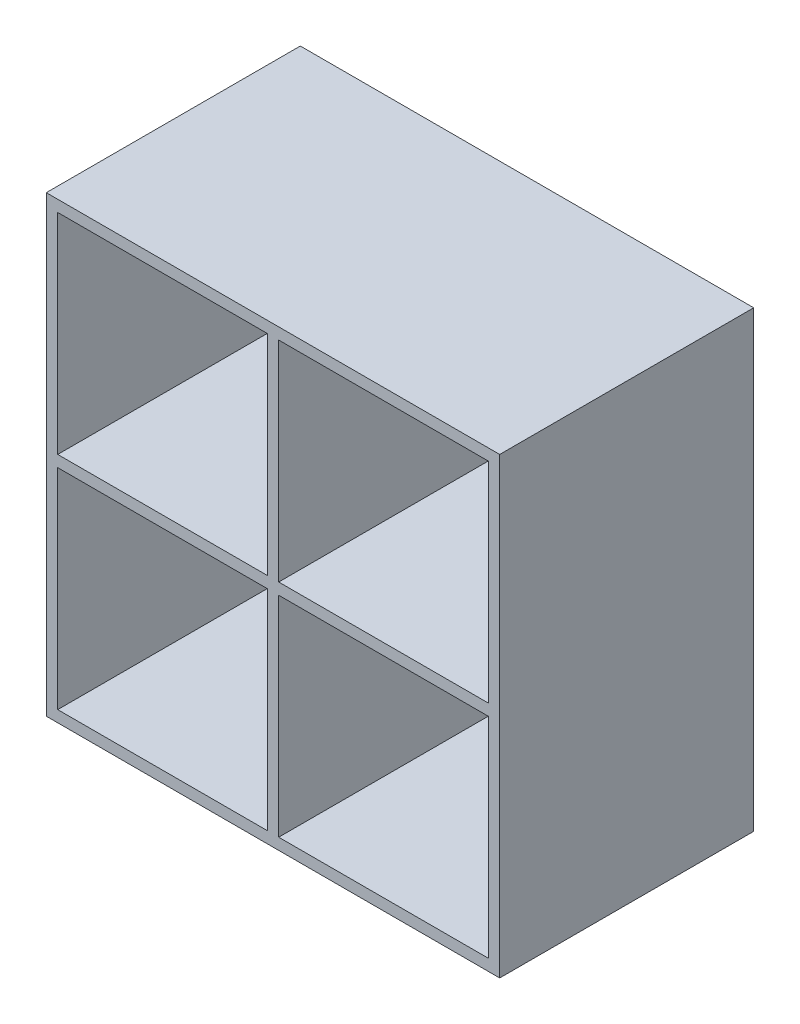
ISO-10303-21;
HEADER;
FILE_DESCRIPTION(('STEP AP214'),'2;1');
FILE_NAME('part.step','',(''),(''),'','','');
FILE_SCHEMA(('AUTOMOTIVE_DESIGN { 1 0 10303 214 1 1 1 1 }'));
ENDSEC;
DATA;
#1=APPLICATION_CONTEXT('core data for automotive mechanical design processes');
#2=APPLICATION_PROTOCOL_DEFINITION('international standard','automotive_design',2000,#1);
#3=PRODUCT_CONTEXT('',#1,'mechanical');
#4=PRODUCT('Part','Part','',(#3));
#5=PRODUCT_RELATED_PRODUCT_CATEGORY('part','',(#4));
#6=PRODUCT_DEFINITION_FORMATION('','',#4);
#7=PRODUCT_DEFINITION_CONTEXT('part definition',#1,'design');
#8=PRODUCT_DEFINITION('design','',#6,#7);
#9=PRODUCT_DEFINITION_SHAPE('','',#8);
#10=(LENGTH_UNIT() NAMED_UNIT(*) SI_UNIT(.MILLI.,.METRE.));
#11=(NAMED_UNIT(*) PLANE_ANGLE_UNIT() SI_UNIT($,.RADIAN.));
#12=(NAMED_UNIT(*) SI_UNIT($,.STERADIAN.) SOLID_ANGLE_UNIT());
#13=UNCERTAINTY_MEASURE_WITH_UNIT(LENGTH_MEASURE(1.E-05),#10,'distance_accuracy_value','');
#14=(GEOMETRIC_REPRESENTATION_CONTEXT(3) GLOBAL_UNCERTAINTY_ASSIGNED_CONTEXT((#13)) GLOBAL_UNIT_ASSIGNED_CONTEXT((#10,
#11,#12)) REPRESENTATION_CONTEXT('',''));
#15=CARTESIAN_POINT('',(0.,0.,0.));
#16=DIRECTION('',(0.,0.,1.));
#17=DIRECTION('',(1.,0.,0.));
#18=AXIS2_PLACEMENT_3D('',#15,#16,#17);
#19=CARTESIAN_POINT('',(357.,-357.,-400.));
#20=DIRECTION('',(1.,0.,0.));
#21=DIRECTION('',(0.,1.,0.));
#22=AXIS2_PLACEMENT_3D('',#19,#20,#21);
#23=PLANE('',#22);
#24=DIRECTION('',(0.,1.,0.));
#25=VECTOR('',#24,1.);
#26=CARTESIAN_POINT('',(357.,-357.,0.));
#27=LINE('',#26,#25);
#28=CARTESIAN_POINT('',(357.,-357.,0.));
#29=VERTEX_POINT('',#28);
#30=CARTESIAN_POINT('',(357.,357.,0.));
#31=VERTEX_POINT('',#30);
#32=EDGE_CURVE('E296',#29,#31,#27,.T.);
#33=ORIENTED_EDGE('',*,*,#32,.F.);
#34=DIRECTION('',(0.,0.,1.));
#35=VECTOR('',#34,1.);
#36=CARTESIAN_POINT('',(357.,-357.,-400.));
#37=LINE('',#36,#35);
#38=CARTESIAN_POINT('',(357.,-357.,-400.));
#39=VERTEX_POINT('',#38);
#40=EDGE_CURVE('E11',#39,#29,#37,.T.);
#41=ORIENTED_EDGE('',*,*,#40,.F.);
#42=DIRECTION('',(0.,1.,0.));
#43=VECTOR('',#42,1.);
#44=CARTESIAN_POINT('',(357.,-357.,-400.));
#45=LINE('',#44,#43);
#46=CARTESIAN_POINT('',(357.,357.,-400.));
#47=VERTEX_POINT('',#46);
#48=EDGE_CURVE('E303',#39,#47,#45,.T.);
#49=ORIENTED_EDGE('',*,*,#48,.T.);
#50=DIRECTION('',(0.,0.,1.));
#51=VECTOR('',#50,1.);
#52=CARTESIAN_POINT('',(357.,357.,-400.));
#53=LINE('',#52,#51);
#54=EDGE_CURVE('E36',#47,#31,#53,.T.);
#55=ORIENTED_EDGE('',*,*,#54,.T.);
#56=EDGE_LOOP('',(#33,#41,#49,#55));
#57=FACE_BOUND('',#56,.T.);
#58=ADVANCED_FACE('F33',(#57),#23,.T.);
#59=CARTESIAN_POINT('',(-357.,-357.,-400.));
#60=DIRECTION('',(0.,-1.,0.));
#61=DIRECTION('',(0.,0.,-1.));
#62=AXIS2_PLACEMENT_3D('',#59,#60,#61);
#63=PLANE('',#62);
#64=DIRECTION('',(1.,0.,0.));
#65=VECTOR('',#64,1.);
#66=CARTESIAN_POINT('',(-357.,-357.,0.));
#67=LINE('',#66,#65);
#68=CARTESIAN_POINT('',(-357.,-357.,0.));
#69=VERTEX_POINT('',#68);
#70=EDGE_CURVE('E307',#69,#29,#67,.T.);
#71=ORIENTED_EDGE('',*,*,#70,.F.);
#72=DIRECTION('',(0.,0.,1.));
#73=VECTOR('',#72,1.);
#74=CARTESIAN_POINT('',(-357.,-357.,-400.));
#75=LINE('',#74,#73);
#76=CARTESIAN_POINT('',(-357.,-357.,-400.));
#77=VERTEX_POINT('',#76);
#78=EDGE_CURVE('E41',#77,#69,#75,.T.);
#79=ORIENTED_EDGE('',*,*,#78,.F.);
#80=DIRECTION('',(1.,0.,0.));
#81=VECTOR('',#80,1.);
#82=CARTESIAN_POINT('',(-357.,-357.,-400.));
#83=LINE('',#82,#81);
#84=EDGE_CURVE('E313',#77,#39,#83,.T.);
#85=ORIENTED_EDGE('',*,*,#84,.T.);
#86=ORIENTED_EDGE('',*,*,#40,.T.);
#87=EDGE_LOOP('',(#71,#79,#85,#86));
#88=FACE_BOUND('',#87,.T.);
#89=ADVANCED_FACE('F339',(#88),#63,.T.);
#90=CARTESIAN_POINT('',(-357.,-357.,-400.));
#91=DIRECTION('',(-1.,0.,0.));
#92=DIRECTION('',(0.,-1.,0.));
#93=AXIS2_PLACEMENT_3D('',#90,#91,#92);
#94=PLANE('',#93);
#95=DIRECTION('',(0.,-1.,0.));
#96=VECTOR('',#95,1.);
#97=CARTESIAN_POINT('',(-357.,-357.,0.));
#98=LINE('',#97,#96);
#99=CARTESIAN_POINT('',(-357.,357.,0.));
#100=VERTEX_POINT('',#99);
#101=EDGE_CURVE('E321',#100,#69,#98,.T.);
#102=ORIENTED_EDGE('',*,*,#101,.F.);
#103=DIRECTION('',(0.,0.,1.));
#104=VECTOR('',#103,1.);
#105=CARTESIAN_POINT('',(-357.,357.,-400.));
#106=LINE('',#105,#104);
#107=CARTESIAN_POINT('',(-357.,357.,-400.));
#108=VERTEX_POINT('',#107);
#109=EDGE_CURVE('E326',#108,#100,#106,.T.);
#110=ORIENTED_EDGE('',*,*,#109,.F.);
#111=DIRECTION('',(0.,-1.,0.));
#112=VECTOR('',#111,1.);
#113=CARTESIAN_POINT('',(-357.,-357.,-400.));
#114=LINE('',#113,#112);
#115=EDGE_CURVE('E310',#108,#77,#114,.T.);
#116=ORIENTED_EDGE('',*,*,#115,.T.);
#117=ORIENTED_EDGE('',*,*,#78,.T.);
#118=EDGE_LOOP('',(#102,#110,#116,#117));
#119=FACE_BOUND('',#118,.T.);
#120=ADVANCED_FACE('F344',(#119),#94,.T.);
#121=CARTESIAN_POINT('',(-357.,357.,-400.));
#122=DIRECTION('',(0.,1.,0.));
#123=DIRECTION('',(0.,0.,1.));
#124=AXIS2_PLACEMENT_3D('',#121,#122,#123);
#125=PLANE('',#124);
#126=DIRECTION('',(-1.,0.,0.));
#127=VECTOR('',#126,1.);
#128=CARTESIAN_POINT('',(-357.,357.,0.));
#129=LINE('',#128,#127);
#130=EDGE_CURVE('E318',#31,#100,#129,.T.);
#131=ORIENTED_EDGE('',*,*,#130,.F.);
#132=ORIENTED_EDGE('',*,*,#54,.F.);
#133=DIRECTION('',(-1.,0.,0.));
#134=VECTOR('',#133,1.);
#135=CARTESIAN_POINT('',(-357.,357.,-400.));
#136=LINE('',#135,#134);
#137=EDGE_CURVE('E306',#47,#108,#136,.T.);
#138=ORIENTED_EDGE('',*,*,#137,.T.);
#139=ORIENTED_EDGE('',*,*,#109,.T.);
#140=EDGE_LOOP('',(#131,#132,#138,#139));
#141=FACE_BOUND('',#140,.T.);
#142=ADVANCED_FACE('F334',(#141),#125,.T.);
#143=CARTESIAN_POINT('',(0.,0.,-400.));
#144=DIRECTION('',(0.,0.,-1.));
#145=DIRECTION('',(-1.,0.,0.));
#146=AXIS2_PLACEMENT_3D('',#143,#144,#145);
#147=PLANE('',#146);
#148=DIRECTION('',(0.,-1.,0.));
#149=VECTOR('',#148,1.);
#150=CARTESIAN_POINT('',(-339.,-339.,-400.));
#151=LINE('',#150,#149);
#152=CARTESIAN_POINT('',(-339.,-9.00000000000001,-400.));
#153=VERTEX_POINT('',#152);
#154=CARTESIAN_POINT('',(-339.,-339.,-400.));
#155=VERTEX_POINT('',#154);
#156=EDGE_CURVE('E172',#153,#155,#151,.T.);
#157=ORIENTED_EDGE('',*,*,#156,.T.);
#158=DIRECTION('',(1.,0.,0.));
#159=VECTOR('',#158,1.);
#160=CARTESIAN_POINT('',(-8.99999999999967,-339.,-400.));
#161=LINE('',#160,#159);
#162=CARTESIAN_POINT('',(-8.99999999999967,-339.,-400.));
#163=VERTEX_POINT('',#162);
#164=EDGE_CURVE('E181',#155,#163,#161,.T.);
#165=ORIENTED_EDGE('',*,*,#164,.T.);
#166=DIRECTION('',(0.,1.,0.));
#167=VECTOR('',#166,1.);
#168=CARTESIAN_POINT('',(-8.99999999999967,-339.,-400.));
#169=LINE('',#168,#167);
#170=CARTESIAN_POINT('',(-8.99999999999967,-9.00000000000001,-400.));
#171=VERTEX_POINT('',#170);
#172=EDGE_CURVE('E49',#163,#171,#169,.T.);
#173=ORIENTED_EDGE('',*,*,#172,.T.);
#174=DIRECTION('',(-1.,0.,0.));
#175=VECTOR('',#174,1.);
#176=CARTESIAN_POINT('',(-8.99999999999967,-9.00000000000001,-400.));
#177=LINE('',#176,#175);
#178=EDGE_CURVE('E178',#171,#153,#177,.T.);
#179=ORIENTED_EDGE('',*,*,#178,.T.);
#180=EDGE_LOOP('',(#157,#165,#173,#179));
#181=FACE_BOUND('',#180,.T.);
#182=DIRECTION('',(0.,1.,0.));
#183=VECTOR('',#182,1.);
#184=CARTESIAN_POINT('',(339.,-339.,-400.));
#185=LINE('',#184,#183);
#186=CARTESIAN_POINT('',(339.,-339.,-400.));
#187=VERTEX_POINT('',#186);
#188=CARTESIAN_POINT('',(339.,-8.99999999999993,-400.));
#189=VERTEX_POINT('',#188);
#190=EDGE_CURVE('E207',#187,#189,#185,.T.);
#191=ORIENTED_EDGE('',*,*,#190,.T.);
#192=DIRECTION('',(-1.,0.,0.));
#193=VECTOR('',#192,1.);
#194=CARTESIAN_POINT('',(9.00000000000026,-8.99999999999993,-400.));
#195=LINE('',#194,#193);
#196=CARTESIAN_POINT('',(9.00000000000026,-8.99999999999993,-400.));
#197=VERTEX_POINT('',#196);
#198=EDGE_CURVE('E210',#189,#197,#195,.T.);
#199=ORIENTED_EDGE('',*,*,#198,.T.);
#200=DIRECTION('',(0.,-1.,0.));
#201=VECTOR('',#200,1.);
#202=CARTESIAN_POINT('',(9.00000000000026,-339.,-400.));
#203=LINE('',#202,#201);
#204=CARTESIAN_POINT('',(9.00000000000026,-339.,-400.));
#205=VERTEX_POINT('',#204);
#206=EDGE_CURVE('E214',#197,#205,#203,.T.);
#207=ORIENTED_EDGE('',*,*,#206,.T.);
#208=DIRECTION('',(1.,0.,0.));
#209=VECTOR('',#208,1.);
#210=CARTESIAN_POINT('',(9.00000000000026,-339.,-400.));
#211=LINE('',#210,#209);
#212=EDGE_CURVE('E217',#205,#187,#211,.T.);
#213=ORIENTED_EDGE('',*,*,#212,.T.);
#214=EDGE_LOOP('',(#191,#199,#207,#213));
#215=FACE_BOUND('',#214,.T.);
#216=DIRECTION('',(0.,1.,0.));
#217=VECTOR('',#216,1.);
#218=CARTESIAN_POINT('',(339.,9.00000000000006,-400.));
#219=LINE('',#218,#217);
#220=CARTESIAN_POINT('',(339.,9.00000000000006,-400.));
#221=VERTEX_POINT('',#220);
#222=CARTESIAN_POINT('',(339.,339.,-400.));
#223=VERTEX_POINT('',#222);
#224=EDGE_CURVE('E239',#221,#223,#219,.T.);
#225=ORIENTED_EDGE('',*,*,#224,.T.);
#226=DIRECTION('',(-1.,0.,0.));
#227=VECTOR('',#226,1.);
#228=CARTESIAN_POINT('',(9.00000000000017,339.,-400.));
#229=LINE('',#228,#227);
#230=CARTESIAN_POINT('',(9.00000000000017,339.,-400.));
#231=VERTEX_POINT('',#230);
#232=EDGE_CURVE('E242',#223,#231,#229,.T.);
#233=ORIENTED_EDGE('',*,*,#232,.T.);
#234=DIRECTION('',(0.,-1.,0.));
#235=VECTOR('',#234,1.);
#236=CARTESIAN_POINT('',(9.00000000000017,9.00000000000006,-400.));
#237=LINE('',#236,#235);
#238=CARTESIAN_POINT('',(9.00000000000017,9.00000000000006,-400.));
#239=VERTEX_POINT('',#238);
#240=EDGE_CURVE('E246',#231,#239,#237,.T.);
#241=ORIENTED_EDGE('',*,*,#240,.T.);
#242=DIRECTION('',(1.,0.,0.));
#243=VECTOR('',#242,1.);
#244=CARTESIAN_POINT('',(9.00000000000017,9.00000000000006,-400.));
#245=LINE('',#244,#243);
#246=EDGE_CURVE('E249',#239,#221,#245,.T.);
#247=ORIENTED_EDGE('',*,*,#246,.T.);
#248=EDGE_LOOP('',(#225,#233,#241,#247));
#249=FACE_BOUND('',#248,.T.);
#250=DIRECTION('',(0.,1.,0.));
#251=VECTOR('',#250,1.);
#252=CARTESIAN_POINT('',(-8.99999999999984,9.00000000000006,-400.));
#253=LINE('',#252,#251);
#254=CARTESIAN_POINT('',(-8.99999999999984,9.00000000000006,-400.));
#255=VERTEX_POINT('',#254);
#256=CARTESIAN_POINT('',(-8.99999999999982,339.,-400.));
#257=VERTEX_POINT('',#256);
#258=EDGE_CURVE('E271',#255,#257,#253,.T.);
#259=ORIENTED_EDGE('',*,*,#258,.T.);
#260=DIRECTION('',(-1.,0.,0.));
#261=VECTOR('',#260,1.);
#262=CARTESIAN_POINT('',(-339.,339.,-400.));
#263=LINE('',#262,#261);
#264=CARTESIAN_POINT('',(-339.,339.,-400.));
#265=VERTEX_POINT('',#264);
#266=EDGE_CURVE('E274',#257,#265,#263,.T.);
#267=ORIENTED_EDGE('',*,*,#266,.T.);
#268=DIRECTION('',(0.,-1.,0.));
#269=VECTOR('',#268,1.);
#270=CARTESIAN_POINT('',(-339.,9.00000000000006,-400.));
#271=LINE('',#270,#269);
#272=CARTESIAN_POINT('',(-339.,9.00000000000006,-400.));
#273=VERTEX_POINT('',#272);
#274=EDGE_CURVE('E278',#265,#273,#271,.T.);
#275=ORIENTED_EDGE('',*,*,#274,.T.);
#276=DIRECTION('',(1.,0.,0.));
#277=VECTOR('',#276,1.);
#278=CARTESIAN_POINT('',(-339.,9.00000000000006,-400.));
#279=LINE('',#278,#277);
#280=EDGE_CURVE('E281',#273,#255,#279,.T.);
#281=ORIENTED_EDGE('',*,*,#280,.T.);
#282=EDGE_LOOP('',(#259,#267,#275,#281));
#283=FACE_BOUND('',#282,.T.);
#284=ORIENTED_EDGE('',*,*,#48,.F.);
#285=ORIENTED_EDGE('',*,*,#84,.F.);
#286=ORIENTED_EDGE('',*,*,#115,.F.);
#287=ORIENTED_EDGE('',*,*,#137,.F.);
#288=EDGE_LOOP('',(#284,#285,#286,#287));
#289=FACE_BOUND('',#288,.T.);
#290=ADVANCED_FACE('F185',(#181,#215,#249,#283,#289),#147,.T.);
#291=CARTESIAN_POINT('',(0.,0.,0.));
#292=DIRECTION('',(0.,0.,-1.));
#293=DIRECTION('',(-1.,0.,0.));
#294=AXIS2_PLACEMENT_3D('',#291,#292,#293);
#295=PLANE('',#294);
#296=DIRECTION('',(1.,0.,0.));
#297=VECTOR('',#296,1.);
#298=CARTESIAN_POINT('',(-8.99999999999967,-339.,0.));
#299=LINE('',#298,#297);
#300=CARTESIAN_POINT('',(-339.,-339.,0.));
#301=VERTEX_POINT('',#300);
#302=CARTESIAN_POINT('',(-8.99999999999967,-339.,0.));
#303=VERTEX_POINT('',#302);
#304=EDGE_CURVE('E197',#301,#303,#299,.T.);
#305=ORIENTED_EDGE('',*,*,#304,.F.);
#306=DIRECTION('',(0.,-1.,0.));
#307=VECTOR('',#306,1.);
#308=CARTESIAN_POINT('',(-339.,-339.,0.));
#309=LINE('',#308,#307);
#310=CARTESIAN_POINT('',(-339.,-9.00000000000001,0.));
#311=VERTEX_POINT('',#310);
#312=EDGE_CURVE('E57',#311,#301,#309,.T.);
#313=ORIENTED_EDGE('',*,*,#312,.F.);
#314=DIRECTION('',(-1.,0.,0.));
#315=VECTOR('',#314,1.);
#316=CARTESIAN_POINT('',(-8.99999999999967,-9.00000000000001,0.));
#317=LINE('',#316,#315);
#318=CARTESIAN_POINT('',(-8.99999999999967,-9.00000000000001,0.));
#319=VERTEX_POINT('',#318);
#320=EDGE_CURVE('E188',#319,#311,#317,.T.);
#321=ORIENTED_EDGE('',*,*,#320,.F.);
#322=DIRECTION('',(0.,1.,0.));
#323=VECTOR('',#322,1.);
#324=CARTESIAN_POINT('',(-8.99999999999967,-339.,0.));
#325=LINE('',#324,#323);
#326=EDGE_CURVE('E191',#303,#319,#325,.T.);
#327=ORIENTED_EDGE('',*,*,#326,.F.);
#328=EDGE_LOOP('',(#305,#313,#321,#327));
#329=FACE_BOUND('',#328,.T.);
#330=DIRECTION('',(-1.,0.,0.));
#331=VECTOR('',#330,1.);
#332=CARTESIAN_POINT('',(9.00000000000026,-8.99999999999993,0.));
#333=LINE('',#332,#331);
#334=CARTESIAN_POINT('',(339.,-8.99999999999993,0.));
#335=VERTEX_POINT('',#334);
#336=CARTESIAN_POINT('',(9.00000000000026,-8.99999999999993,0.));
#337=VERTEX_POINT('',#336);
#338=EDGE_CURVE('E222',#335,#337,#333,.T.);
#339=ORIENTED_EDGE('',*,*,#338,.F.);
#340=DIRECTION('',(0.,1.,0.));
#341=VECTOR('',#340,1.);
#342=CARTESIAN_POINT('',(339.,-339.,0.));
#343=LINE('',#342,#341);
#344=CARTESIAN_POINT('',(339.,-339.,0.));
#345=VERTEX_POINT('',#344);
#346=EDGE_CURVE('E203',#345,#335,#343,.T.);
#347=ORIENTED_EDGE('',*,*,#346,.F.);
#348=DIRECTION('',(1.,0.,0.));
#349=VECTOR('',#348,1.);
#350=CARTESIAN_POINT('',(9.00000000000026,-339.,0.));
#351=LINE('',#350,#349);
#352=CARTESIAN_POINT('',(9.00000000000026,-339.,0.));
#353=VERTEX_POINT('',#352);
#354=EDGE_CURVE('E211',#353,#345,#351,.T.);
#355=ORIENTED_EDGE('',*,*,#354,.F.);
#356=DIRECTION('',(0.,-1.,0.));
#357=VECTOR('',#356,1.);
#358=CARTESIAN_POINT('',(9.00000000000026,-339.,0.));
#359=LINE('',#358,#357);
#360=EDGE_CURVE('E225',#337,#353,#359,.T.);
#361=ORIENTED_EDGE('',*,*,#360,.F.);
#362=EDGE_LOOP('',(#339,#347,#355,#361));
#363=FACE_BOUND('',#362,.T.);
#364=DIRECTION('',(-1.,0.,0.));
#365=VECTOR('',#364,1.);
#366=CARTESIAN_POINT('',(9.00000000000017,339.,0.));
#367=LINE('',#366,#365);
#368=CARTESIAN_POINT('',(339.,339.,0.));
#369=VERTEX_POINT('',#368);
#370=CARTESIAN_POINT('',(9.00000000000017,339.,0.));
#371=VERTEX_POINT('',#370);
#372=EDGE_CURVE('E254',#369,#371,#367,.T.);
#373=ORIENTED_EDGE('',*,*,#372,.F.);
#374=DIRECTION('',(0.,1.,0.));
#375=VECTOR('',#374,1.);
#376=CARTESIAN_POINT('',(339.,9.00000000000006,0.));
#377=LINE('',#376,#375);
#378=CARTESIAN_POINT('',(339.,9.00000000000006,0.));
#379=VERTEX_POINT('',#378);
#380=EDGE_CURVE('E232',#379,#369,#377,.T.);
#381=ORIENTED_EDGE('',*,*,#380,.F.);
#382=DIRECTION('',(1.,0.,0.));
#383=VECTOR('',#382,1.);
#384=CARTESIAN_POINT('',(9.00000000000017,9.00000000000006,0.));
#385=LINE('',#384,#383);
#386=CARTESIAN_POINT('',(9.00000000000017,9.00000000000006,0.));
#387=VERTEX_POINT('',#386);
#388=EDGE_CURVE('E243',#387,#379,#385,.T.);
#389=ORIENTED_EDGE('',*,*,#388,.F.);
#390=DIRECTION('',(0.,-1.,0.));
#391=VECTOR('',#390,1.);
#392=CARTESIAN_POINT('',(9.00000000000017,9.00000000000006,0.));
#393=LINE('',#392,#391);
#394=EDGE_CURVE('E257',#371,#387,#393,.T.);
#395=ORIENTED_EDGE('',*,*,#394,.F.);
#396=EDGE_LOOP('',(#373,#381,#389,#395));
#397=FACE_BOUND('',#396,.T.);
#398=DIRECTION('',(-1.,0.,0.));
#399=VECTOR('',#398,1.);
#400=CARTESIAN_POINT('',(-339.,339.,0.));
#401=LINE('',#400,#399);
#402=CARTESIAN_POINT('',(-8.99999999999982,339.,0.));
#403=VERTEX_POINT('',#402);
#404=CARTESIAN_POINT('',(-339.,339.,0.));
#405=VERTEX_POINT('',#404);
#406=EDGE_CURVE('E286',#403,#405,#401,.T.);
#407=ORIENTED_EDGE('',*,*,#406,.F.);
#408=DIRECTION('',(0.,1.,0.));
#409=VECTOR('',#408,1.);
#410=CARTESIAN_POINT('',(-8.99999999999984,9.00000000000006,0.));
#411=LINE('',#410,#409);
#412=CARTESIAN_POINT('',(-8.99999999999984,9.00000000000006,0.));
#413=VERTEX_POINT('',#412);
#414=EDGE_CURVE('E264',#413,#403,#411,.T.);
#415=ORIENTED_EDGE('',*,*,#414,.F.);
#416=DIRECTION('',(1.,0.,0.));
#417=VECTOR('',#416,1.);
#418=CARTESIAN_POINT('',(-339.,9.00000000000006,0.));
#419=LINE('',#418,#417);
#420=CARTESIAN_POINT('',(-339.,9.00000000000006,0.));
#421=VERTEX_POINT('',#420);
#422=EDGE_CURVE('E275',#421,#413,#419,.T.);
#423=ORIENTED_EDGE('',*,*,#422,.F.);
#424=DIRECTION('',(0.,-1.,0.));
#425=VECTOR('',#424,1.);
#426=CARTESIAN_POINT('',(-339.,9.00000000000006,0.));
#427=LINE('',#426,#425);
#428=EDGE_CURVE('E289',#405,#421,#427,.T.);
#429=ORIENTED_EDGE('',*,*,#428,.F.);
#430=EDGE_LOOP('',(#407,#415,#423,#429));
#431=FACE_BOUND('',#430,.T.);
#432=ORIENTED_EDGE('',*,*,#32,.T.);
#433=ORIENTED_EDGE('',*,*,#130,.T.);
#434=ORIENTED_EDGE('',*,*,#101,.T.);
#435=ORIENTED_EDGE('',*,*,#70,.T.);
#436=EDGE_LOOP('',(#432,#433,#434,#435));
#437=FACE_BOUND('',#436,.T.);
#438=ADVANCED_FACE('F336',(#329,#363,#397,#431,#437),#295,.F.);
#439=CARTESIAN_POINT('',(-8.99999999999984,9.00000000000006,-400.));
#440=DIRECTION('',(1.,0.,0.));
#441=DIRECTION('',(0.,1.,0.));
#442=AXIS2_PLACEMENT_3D('',#439,#440,#441);
#443=PLANE('',#442);
#444=ORIENTED_EDGE('',*,*,#414,.T.);
#445=DIRECTION('',(0.,0.,1.));
#446=VECTOR('',#445,1.);
#447=CARTESIAN_POINT('',(-8.99999999999982,339.,-400.));
#448=LINE('',#447,#446);
#449=EDGE_CURVE('E284',#257,#403,#448,.T.);
#450=ORIENTED_EDGE('',*,*,#449,.F.);
#451=ORIENTED_EDGE('',*,*,#258,.F.);
#452=DIRECTION('',(0.,0.,1.));
#453=VECTOR('',#452,1.);
#454=CARTESIAN_POINT('',(-8.99999999999984,9.00000000000006,-400.));
#455=LINE('',#454,#453);
#456=EDGE_CURVE('E294',#255,#413,#455,.T.);
#457=ORIENTED_EDGE('',*,*,#456,.T.);
#458=EDGE_LOOP('',(#444,#450,#451,#457));
#459=FACE_BOUND('',#458,.T.);
#460=ADVANCED_FACE('F386',(#459),#443,.F.);
#461=CARTESIAN_POINT('',(-339.,9.00000000000006,-400.));
#462=DIRECTION('',(0.,-1.,0.));
#463=DIRECTION('',(0.,0.,-1.));
#464=AXIS2_PLACEMENT_3D('',#461,#462,#463);
#465=PLANE('',#464);
#466=ORIENTED_EDGE('',*,*,#422,.T.);
#467=ORIENTED_EDGE('',*,*,#456,.F.);
#468=ORIENTED_EDGE('',*,*,#280,.F.);
#469=DIRECTION('',(0.,0.,1.));
#470=VECTOR('',#469,1.);
#471=CARTESIAN_POINT('',(-339.,9.00000000000006,-400.));
#472=LINE('',#471,#470);
#473=EDGE_CURVE('E297',#273,#421,#472,.T.);
#474=ORIENTED_EDGE('',*,*,#473,.T.);
#475=EDGE_LOOP('',(#466,#467,#468,#474));
#476=FACE_BOUND('',#475,.T.);
#477=ADVANCED_FACE('F396',(#476),#465,.F.);
#478=CARTESIAN_POINT('',(-339.,9.00000000000006,-400.));
#479=DIRECTION('',(-1.,0.,0.));
#480=DIRECTION('',(0.,0.,1.));
#481=AXIS2_PLACEMENT_3D('',#478,#479,#480);
#482=PLANE('',#481);
#483=ORIENTED_EDGE('',*,*,#428,.T.);
#484=ORIENTED_EDGE('',*,*,#473,.F.);
#485=ORIENTED_EDGE('',*,*,#274,.F.);
#486=DIRECTION('',(0.,0.,1.));
#487=VECTOR('',#486,1.);
#488=CARTESIAN_POINT('',(-339.,339.,-400.));
#489=LINE('',#488,#487);
#490=EDGE_CURVE('E299',#265,#405,#489,.T.);
#491=ORIENTED_EDGE('',*,*,#490,.T.);
#492=EDGE_LOOP('',(#483,#484,#485,#491));
#493=FACE_BOUND('',#492,.T.);
#494=ADVANCED_FACE('F406',(#493),#482,.F.);
#495=CARTESIAN_POINT('',(-339.,339.,-400.));
#496=DIRECTION('',(0.,1.,0.));
#497=DIRECTION('',(0.,0.,1.));
#498=AXIS2_PLACEMENT_3D('',#495,#496,#497);
#499=PLANE('',#498);
#500=ORIENTED_EDGE('',*,*,#406,.T.);
#501=ORIENTED_EDGE('',*,*,#490,.F.);
#502=ORIENTED_EDGE('',*,*,#266,.F.);
#503=ORIENTED_EDGE('',*,*,#449,.T.);
#504=EDGE_LOOP('',(#500,#501,#502,#503));
#505=FACE_BOUND('',#504,.T.);
#506=ADVANCED_FACE('F416',(#505),#499,.F.);
#507=CARTESIAN_POINT('',(339.,9.00000000000006,-400.));
#508=DIRECTION('',(1.,0.,0.));
#509=DIRECTION('',(0.,1.,0.));
#510=AXIS2_PLACEMENT_3D('',#507,#508,#509);
#511=PLANE('',#510);
#512=ORIENTED_EDGE('',*,*,#380,.T.);
#513=DIRECTION('',(0.,0.,1.));
#514=VECTOR('',#513,1.);
#515=CARTESIAN_POINT('',(339.,339.,-400.));
#516=LINE('',#515,#514);
#517=EDGE_CURVE('E252',#223,#369,#516,.T.);
#518=ORIENTED_EDGE('',*,*,#517,.F.);
#519=ORIENTED_EDGE('',*,*,#224,.F.);
#520=DIRECTION('',(0.,0.,1.));
#521=VECTOR('',#520,1.);
#522=CARTESIAN_POINT('',(339.,9.00000000000006,-400.));
#523=LINE('',#522,#521);
#524=EDGE_CURVE('E262',#221,#379,#523,.T.);
#525=ORIENTED_EDGE('',*,*,#524,.T.);
#526=EDGE_LOOP('',(#512,#518,#519,#525));
#527=FACE_BOUND('',#526,.T.);
#528=ADVANCED_FACE('F426',(#527),#511,.F.);
#529=CARTESIAN_POINT('',(9.00000000000017,9.00000000000006,-400.));
#530=DIRECTION('',(0.,-1.,0.));
#531=DIRECTION('',(0.,0.,-1.));
#532=AXIS2_PLACEMENT_3D('',#529,#530,#531);
#533=PLANE('',#532);
#534=ORIENTED_EDGE('',*,*,#388,.T.);
#535=ORIENTED_EDGE('',*,*,#524,.F.);
#536=ORIENTED_EDGE('',*,*,#246,.F.);
#537=DIRECTION('',(0.,0.,1.));
#538=VECTOR('',#537,1.);
#539=CARTESIAN_POINT('',(9.00000000000017,9.00000000000006,-400.));
#540=LINE('',#539,#538);
#541=EDGE_CURVE('E265',#239,#387,#540,.T.);
#542=ORIENTED_EDGE('',*,*,#541,.T.);
#543=EDGE_LOOP('',(#534,#535,#536,#542));
#544=FACE_BOUND('',#543,.T.);
#545=ADVANCED_FACE('F436',(#544),#533,.F.);
#546=CARTESIAN_POINT('',(9.00000000000017,9.00000000000006,-400.));
#547=DIRECTION('',(-1.,0.,0.));
#548=DIRECTION('',(0.,0.,1.));
#549=AXIS2_PLACEMENT_3D('',#546,#547,#548);
#550=PLANE('',#549);
#551=ORIENTED_EDGE('',*,*,#394,.T.);
#552=ORIENTED_EDGE('',*,*,#541,.F.);
#553=ORIENTED_EDGE('',*,*,#240,.F.);
#554=DIRECTION('',(0.,0.,1.));
#555=VECTOR('',#554,1.);
#556=CARTESIAN_POINT('',(9.00000000000017,339.,-400.));
#557=LINE('',#556,#555);
#558=EDGE_CURVE('E267',#231,#371,#557,.T.);
#559=ORIENTED_EDGE('',*,*,#558,.T.);
#560=EDGE_LOOP('',(#551,#552,#553,#559));
#561=FACE_BOUND('',#560,.T.);
#562=ADVANCED_FACE('F446',(#561),#550,.F.);
#563=CARTESIAN_POINT('',(9.00000000000017,339.,-400.));
#564=DIRECTION('',(0.,1.,0.));
#565=DIRECTION('',(0.,0.,1.));
#566=AXIS2_PLACEMENT_3D('',#563,#564,#565);
#567=PLANE('',#566);
#568=ORIENTED_EDGE('',*,*,#372,.T.);
#569=ORIENTED_EDGE('',*,*,#558,.F.);
#570=ORIENTED_EDGE('',*,*,#232,.F.);
#571=ORIENTED_EDGE('',*,*,#517,.T.);
#572=EDGE_LOOP('',(#568,#569,#570,#571));
#573=FACE_BOUND('',#572,.T.);
#574=ADVANCED_FACE('F456',(#573),#567,.F.);
#575=CARTESIAN_POINT('',(339.,-339.,-400.));
#576=DIRECTION('',(1.,0.,0.));
#577=DIRECTION('',(0.,0.,-1.));
#578=AXIS2_PLACEMENT_3D('',#575,#576,#577);
#579=PLANE('',#578);
#580=ORIENTED_EDGE('',*,*,#346,.T.);
#581=DIRECTION('',(0.,0.,1.));
#582=VECTOR('',#581,1.);
#583=CARTESIAN_POINT('',(339.,-8.99999999999993,-400.));
#584=LINE('',#583,#582);
#585=EDGE_CURVE('E220',#189,#335,#584,.T.);
#586=ORIENTED_EDGE('',*,*,#585,.F.);
#587=ORIENTED_EDGE('',*,*,#190,.F.);
#588=DIRECTION('',(0.,0.,1.));
#589=VECTOR('',#588,1.);
#590=CARTESIAN_POINT('',(339.,-339.,-400.));
#591=LINE('',#590,#589);
#592=EDGE_CURVE('E230',#187,#345,#591,.T.);
#593=ORIENTED_EDGE('',*,*,#592,.T.);
#594=EDGE_LOOP('',(#580,#586,#587,#593));
#595=FACE_BOUND('',#594,.T.);
#596=ADVANCED_FACE('F466',(#595),#579,.F.);
#597=CARTESIAN_POINT('',(9.00000000000026,-339.,-400.));
#598=DIRECTION('',(0.,-1.,0.));
#599=DIRECTION('',(0.,0.,-1.));
#600=AXIS2_PLACEMENT_3D('',#597,#598,#599);
#601=PLANE('',#600);
#602=ORIENTED_EDGE('',*,*,#354,.T.);
#603=ORIENTED_EDGE('',*,*,#592,.F.);
#604=ORIENTED_EDGE('',*,*,#212,.F.);
#605=DIRECTION('',(0.,0.,1.));
#606=VECTOR('',#605,1.);
#607=CARTESIAN_POINT('',(9.00000000000026,-339.,-400.));
#608=LINE('',#607,#606);
#609=EDGE_CURVE('E233',#205,#353,#608,.T.);
#610=ORIENTED_EDGE('',*,*,#609,.T.);
#611=EDGE_LOOP('',(#602,#603,#604,#610));
#612=FACE_BOUND('',#611,.T.);
#613=ADVANCED_FACE('F476',(#612),#601,.F.);
#614=CARTESIAN_POINT('',(9.00000000000026,-339.,-400.));
#615=DIRECTION('',(-1.,0.,0.));
#616=DIRECTION('',(0.,0.,1.));
#617=AXIS2_PLACEMENT_3D('',#614,#615,#616);
#618=PLANE('',#617);
#619=ORIENTED_EDGE('',*,*,#360,.T.);
#620=ORIENTED_EDGE('',*,*,#609,.F.);
#621=ORIENTED_EDGE('',*,*,#206,.F.);
#622=DIRECTION('',(0.,0.,1.));
#623=VECTOR('',#622,1.);
#624=CARTESIAN_POINT('',(9.00000000000026,-8.99999999999993,-400.));
#625=LINE('',#624,#623);
#626=EDGE_CURVE('E235',#197,#337,#625,.T.);
#627=ORIENTED_EDGE('',*,*,#626,.T.);
#628=EDGE_LOOP('',(#619,#620,#621,#627));
#629=FACE_BOUND('',#628,.T.);
#630=ADVANCED_FACE('F486',(#629),#618,.F.);
#631=CARTESIAN_POINT('',(9.00000000000026,-8.99999999999993,-400.));
#632=DIRECTION('',(0.,1.,0.));
#633=DIRECTION('',(0.,0.,1.));
#634=AXIS2_PLACEMENT_3D('',#631,#632,#633);
#635=PLANE('',#634);
#636=ORIENTED_EDGE('',*,*,#338,.T.);
#637=ORIENTED_EDGE('',*,*,#626,.F.);
#638=ORIENTED_EDGE('',*,*,#198,.F.);
#639=ORIENTED_EDGE('',*,*,#585,.T.);
#640=EDGE_LOOP('',(#636,#637,#638,#639));
#641=FACE_BOUND('',#640,.T.);
#642=ADVANCED_FACE('F496',(#641),#635,.F.);
#643=CARTESIAN_POINT('',(-339.,-339.,-400.));
#644=DIRECTION('',(-1.,0.,0.));
#645=DIRECTION('',(0.,-1.,0.));
#646=AXIS2_PLACEMENT_3D('',#643,#644,#645);
#647=PLANE('',#646);
#648=ORIENTED_EDGE('',*,*,#312,.T.);
#649=DIRECTION('',(0.,0.,1.));
#650=VECTOR('',#649,1.);
#651=CARTESIAN_POINT('',(-339.,-339.,-400.));
#652=LINE('',#651,#650);
#653=EDGE_CURVE('E168',#155,#301,#652,.T.);
#654=ORIENTED_EDGE('',*,*,#653,.F.);
#655=ORIENTED_EDGE('',*,*,#156,.F.);
#656=DIRECTION('',(0.,0.,1.));
#657=VECTOR('',#656,1.);
#658=CARTESIAN_POINT('',(-339.,-9.00000000000001,-400.));
#659=LINE('',#658,#657);
#660=EDGE_CURVE('E201',#153,#311,#659,.T.);
#661=ORIENTED_EDGE('',*,*,#660,.T.);
#662=EDGE_LOOP('',(#648,#654,#655,#661));
#663=FACE_BOUND('',#662,.T.);
#664=ADVANCED_FACE('F170',(#663),#647,.F.);
#665=CARTESIAN_POINT('',(-8.99999999999967,-9.00000000000001,-400.));
#666=DIRECTION('',(0.,1.,0.));
#667=DIRECTION('',(0.,0.,1.));
#668=AXIS2_PLACEMENT_3D('',#665,#666,#667);
#669=PLANE('',#668);
#670=ORIENTED_EDGE('',*,*,#320,.T.);
#671=ORIENTED_EDGE('',*,*,#660,.F.);
#672=ORIENTED_EDGE('',*,*,#178,.F.);
#673=DIRECTION('',(0.,0.,1.));
#674=VECTOR('',#673,1.);
#675=CARTESIAN_POINT('',(-8.99999999999967,-9.00000000000001,-400.));
#676=LINE('',#675,#674);
#677=EDGE_CURVE('E204',#171,#319,#676,.T.);
#678=ORIENTED_EDGE('',*,*,#677,.T.);
#679=EDGE_LOOP('',(#670,#671,#672,#678));
#680=FACE_BOUND('',#679,.T.);
#681=ADVANCED_FACE('F515',(#680),#669,.F.);
#682=CARTESIAN_POINT('',(-8.99999999999967,-339.,-400.));
#683=DIRECTION('',(1.,0.,0.));
#684=DIRECTION('',(0.,0.,-1.));
#685=AXIS2_PLACEMENT_3D('',#682,#683,#684);
#686=PLANE('',#685);
#687=ORIENTED_EDGE('',*,*,#326,.T.);
#688=ORIENTED_EDGE('',*,*,#677,.F.);
#689=ORIENTED_EDGE('',*,*,#172,.F.);
#690=DIRECTION('',(0.,0.,1.));
#691=VECTOR('',#690,1.);
#692=CARTESIAN_POINT('',(-8.99999999999967,-339.,-400.));
#693=LINE('',#692,#691);
#694=EDGE_CURVE('E177',#163,#303,#693,.T.);
#695=ORIENTED_EDGE('',*,*,#694,.T.);
#696=EDGE_LOOP('',(#687,#688,#689,#695));
#697=FACE_BOUND('',#696,.T.);
#698=ADVANCED_FACE('F524',(#697),#686,.F.);
#699=CARTESIAN_POINT('',(-8.99999999999967,-339.,-400.));
#700=DIRECTION('',(0.,-1.,0.));
#701=DIRECTION('',(1.,0.,0.));
#702=AXIS2_PLACEMENT_3D('',#699,#700,#701);
#703=PLANE('',#702);
#704=ORIENTED_EDGE('',*,*,#304,.T.);
#705=ORIENTED_EDGE('',*,*,#694,.F.);
#706=ORIENTED_EDGE('',*,*,#164,.F.);
#707=ORIENTED_EDGE('',*,*,#653,.T.);
#708=EDGE_LOOP('',(#704,#705,#706,#707));
#709=FACE_BOUND('',#708,.T.);
#710=ADVANCED_FACE('F182',(#709),#703,.F.);
#711=CLOSED_SHELL('',(#58,#89,#120,#142,#290,#438,#460,#477,#494,#506,#528,#545,#562,#574,#596,
#613,#630,#642,#664,#681,#698,#710));
#712=MANIFOLD_SOLID_BREP('B2',#711);
#713=ADVANCED_BREP_SHAPE_REPRESENTATION('',(#18,#712),#14);
#714=SHAPE_DEFINITION_REPRESENTATION(#9,#713);
ENDSEC;
END-ISO-10303-21;
